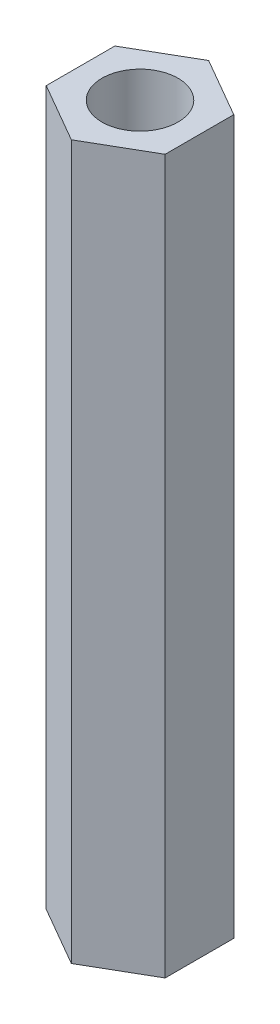
ISO-10303-21;
HEADER;
FILE_DESCRIPTION(('STEP AP214'),'2;1');
FILE_NAME('part.step','',(''),(''),'','','');
FILE_SCHEMA(('AUTOMOTIVE_DESIGN { 1 0 10303 214 1 1 1 1 }'));
ENDSEC;
DATA;
#1=APPLICATION_CONTEXT('core data for automotive mechanical design processes');
#2=APPLICATION_PROTOCOL_DEFINITION('international standard','automotive_design',2000,#1);
#3=PRODUCT_CONTEXT('',#1,'mechanical');
#4=PRODUCT('Part','Part','',(#3));
#5=PRODUCT_RELATED_PRODUCT_CATEGORY('part','',(#4));
#6=PRODUCT_DEFINITION_FORMATION('','',#4);
#7=PRODUCT_DEFINITION_CONTEXT('part definition',#1,'design');
#8=PRODUCT_DEFINITION('design','',#6,#7);
#9=PRODUCT_DEFINITION_SHAPE('','',#8);
#10=(LENGTH_UNIT() NAMED_UNIT(*) SI_UNIT(.MILLI.,.METRE.));
#11=(NAMED_UNIT(*) PLANE_ANGLE_UNIT() SI_UNIT($,.RADIAN.));
#12=(NAMED_UNIT(*) SI_UNIT($,.STERADIAN.) SOLID_ANGLE_UNIT());
#13=UNCERTAINTY_MEASURE_WITH_UNIT(LENGTH_MEASURE(1.E-05),#10,'distance_accuracy_value','');
#14=(GEOMETRIC_REPRESENTATION_CONTEXT(3) GLOBAL_UNCERTAINTY_ASSIGNED_CONTEXT((#13)) GLOBAL_UNIT_ASSIGNED_CONTEXT((#10,
#11,#12)) REPRESENTATION_CONTEXT('',''));
#15=CARTESIAN_POINT('',(0.,0.,0.));
#16=DIRECTION('',(0.,0.,1.));
#17=DIRECTION('',(1.,0.,0.));
#18=AXIS2_PLACEMENT_3D('',#15,#16,#17);
#19=CARTESIAN_POINT('',(0.,30.,0.));
#20=DIRECTION('',(0.,1.,0.));
#21=DIRECTION('',(0.,0.,1.));
#22=AXIS2_PLACEMENT_3D('',#19,#20,#21);
#23=PLANE('',#22);
#24=DIRECTION('',(-0.866025403784438,0.,-0.5));
#25=VECTOR('',#24,1.);
#26=CARTESIAN_POINT('',(2.5,30.,-1.44337567297406));
#27=LINE('',#26,#25);
#28=CARTESIAN_POINT('',(2.5,30.,-1.44337567297406));
#29=VERTEX_POINT('',#28);
#30=CARTESIAN_POINT('',(0.,30.,-2.88675134594813));
#31=VERTEX_POINT('',#30);
#32=EDGE_CURVE('E137',#29,#31,#27,.T.);
#33=ORIENTED_EDGE('',*,*,#32,.T.);
#34=DIRECTION('',(-0.866025403784439,0.,0.5));
#35=VECTOR('',#34,1.);
#36=CARTESIAN_POINT('',(0.,30.,-2.88675134594813));
#37=LINE('',#36,#35);
#38=CARTESIAN_POINT('',(-2.5,30.,-1.44337567297406));
#39=VERTEX_POINT('',#38);
#40=EDGE_CURVE('E95',#31,#39,#37,.T.);
#41=ORIENTED_EDGE('',*,*,#40,.T.);
#42=DIRECTION('',(0.,0.,1.));
#43=VECTOR('',#42,1.);
#44=CARTESIAN_POINT('',(-2.5,30.,-1.44337567297406));
#45=LINE('',#44,#43);
#46=CARTESIAN_POINT('',(-2.5,30.,1.44337567297406));
#47=VERTEX_POINT('',#46);
#48=EDGE_CURVE('E108',#39,#47,#45,.T.);
#49=ORIENTED_EDGE('',*,*,#48,.T.);
#50=DIRECTION('',(0.866025403784439,0.,0.5));
#51=VECTOR('',#50,1.);
#52=CARTESIAN_POINT('',(-2.5,30.,1.44337567297406));
#53=LINE('',#52,#51);
#54=CARTESIAN_POINT('',(0.,30.,2.88675134594813));
#55=VERTEX_POINT('',#54);
#56=EDGE_CURVE('E102',#47,#55,#53,.T.);
#57=ORIENTED_EDGE('',*,*,#56,.T.);
#58=DIRECTION('',(0.866025403784439,0.,-0.5));
#59=VECTOR('',#58,1.);
#60=CARTESIAN_POINT('',(0.,30.,2.88675134594813));
#61=LINE('',#60,#59);
#62=CARTESIAN_POINT('',(2.5,30.,1.44337567297407));
#63=VERTEX_POINT('',#62);
#64=EDGE_CURVE('E106',#55,#63,#61,.T.);
#65=ORIENTED_EDGE('',*,*,#64,.T.);
#66=DIRECTION('',(0.,0.,-1.));
#67=VECTOR('',#66,1.);
#68=CARTESIAN_POINT('',(2.5,30.,1.44337567297407));
#69=LINE('',#68,#67);
#70=EDGE_CURVE('E58',#63,#29,#69,.T.);
#71=ORIENTED_EDGE('',*,*,#70,.T.);
#72=EDGE_LOOP('',(#33,#41,#49,#57,#65,#71));
#73=FACE_BOUND('',#72,.T.);
#74=CARTESIAN_POINT('',(0.,30.,0.));
#75=DIRECTION('',(0.,1.,0.));
#76=DIRECTION('',(0.,0.,1.));
#77=AXIS2_PLACEMENT_3D('',#74,#75,#76);
#78=CIRCLE('',#77,1.6);
#79=CARTESIAN_POINT('',(0.,30.,1.6));
#80=VERTEX_POINT('',#79);
#81=EDGE_CURVE('E130',#80,#80,#78,.T.);
#82=ORIENTED_EDGE('',*,*,#81,.F.);
#83=EDGE_LOOP('',(#82));
#84=FACE_BOUND('',#83,.T.);
#85=ADVANCED_FACE('F41',(#73,#84),#23,.T.);
#86=CARTESIAN_POINT('',(0.,0.,0.));
#87=DIRECTION('',(0.,1.,0.));
#88=DIRECTION('',(0.,0.,1.));
#89=AXIS2_PLACEMENT_3D('',#86,#87,#88);
#90=PLANE('',#89);
#91=DIRECTION('',(-0.866025403784438,0.,-0.5));
#92=VECTOR('',#91,1.);
#93=CARTESIAN_POINT('',(2.5,0.,-1.44337567297406));
#94=LINE('',#93,#92);
#95=CARTESIAN_POINT('',(2.5,0.,-1.44337567297406));
#96=VERTEX_POINT('',#95);
#97=CARTESIAN_POINT('',(0.,0.,-2.88675134594813));
#98=VERTEX_POINT('',#97);
#99=EDGE_CURVE('E126',#96,#98,#94,.T.);
#100=ORIENTED_EDGE('',*,*,#99,.F.);
#101=DIRECTION('',(0.,0.,-1.));
#102=VECTOR('',#101,1.);
#103=CARTESIAN_POINT('',(2.5,0.,1.44337567297407));
#104=LINE('',#103,#102);
#105=CARTESIAN_POINT('',(2.5,0.,1.44337567297407));
#106=VERTEX_POINT('',#105);
#107=EDGE_CURVE('E87',#106,#96,#104,.T.);
#108=ORIENTED_EDGE('',*,*,#107,.F.);
#109=DIRECTION('',(0.866025403784439,0.,-0.5));
#110=VECTOR('',#109,1.);
#111=CARTESIAN_POINT('',(0.,0.,2.88675134594813));
#112=LINE('',#111,#110);
#113=CARTESIAN_POINT('',(0.,0.,2.88675134594813));
#114=VERTEX_POINT('',#113);
#115=EDGE_CURVE('E81',#114,#106,#112,.T.);
#116=ORIENTED_EDGE('',*,*,#115,.F.);
#117=DIRECTION('',(0.866025403784439,0.,0.5));
#118=VECTOR('',#117,1.);
#119=CARTESIAN_POINT('',(-2.5,0.,1.44337567297406));
#120=LINE('',#119,#118);
#121=CARTESIAN_POINT('',(-2.5,0.,1.44337567297406));
#122=VERTEX_POINT('',#121);
#123=EDGE_CURVE('E116',#122,#114,#120,.T.);
#124=ORIENTED_EDGE('',*,*,#123,.F.);
#125=DIRECTION('',(0.,0.,1.));
#126=VECTOR('',#125,1.);
#127=CARTESIAN_POINT('',(-2.5,0.,-1.44337567297406));
#128=LINE('',#127,#126);
#129=CARTESIAN_POINT('',(-2.5,0.,-1.44337567297406));
#130=VERTEX_POINT('',#129);
#131=EDGE_CURVE('E132',#130,#122,#128,.T.);
#132=ORIENTED_EDGE('',*,*,#131,.F.);
#133=DIRECTION('',(-0.866025403784439,0.,0.5));
#134=VECTOR('',#133,1.);
#135=CARTESIAN_POINT('',(0.,0.,-2.88675134594813));
#136=LINE('',#135,#134);
#137=EDGE_CURVE('E129',#98,#130,#136,.T.);
#138=ORIENTED_EDGE('',*,*,#137,.F.);
#139=EDGE_LOOP('',(#100,#108,#116,#124,#132,#138));
#140=FACE_BOUND('',#139,.T.);
#141=CARTESIAN_POINT('',(0.,0.,0.));
#142=DIRECTION('',(0.,1.,0.));
#143=DIRECTION('',(0.,0.,1.));
#144=AXIS2_PLACEMENT_3D('',#141,#142,#143);
#145=CIRCLE('',#144,1.6);
#146=CARTESIAN_POINT('',(0.,0.,1.6));
#147=VERTEX_POINT('',#146);
#148=EDGE_CURVE('E248',#147,#147,#145,.T.);
#149=ORIENTED_EDGE('',*,*,#148,.T.);
#150=EDGE_LOOP('',(#149));
#151=FACE_BOUND('',#150,.T.);
#152=ADVANCED_FACE('F146',(#140,#151),#90,.F.);
#153=CARTESIAN_POINT('',(2.5,30.,-1.44337567297406));
#154=DIRECTION('',(-0.5,0.,0.866025403784438));
#155=DIRECTION('',(0.866025403784439,0.,0.5));
#156=AXIS2_PLACEMENT_3D('',#153,#154,#155);
#157=PLANE('',#156);
#158=ORIENTED_EDGE('',*,*,#99,.T.);
#159=DIRECTION('',(0.,-1.,0.));
#160=VECTOR('',#159,1.);
#161=CARTESIAN_POINT('',(0.,30.,-2.88675134594813));
#162=LINE('',#161,#160);
#163=EDGE_CURVE('E11',#31,#98,#162,.T.);
#164=ORIENTED_EDGE('',*,*,#163,.F.);
#165=ORIENTED_EDGE('',*,*,#32,.F.);
#166=DIRECTION('',(0.,-1.,0.));
#167=VECTOR('',#166,1.);
#168=CARTESIAN_POINT('',(2.5,30.,-1.44337567297406));
#169=LINE('',#168,#167);
#170=EDGE_CURVE('E122',#29,#96,#169,.T.);
#171=ORIENTED_EDGE('',*,*,#170,.T.);
#172=EDGE_LOOP('',(#158,#164,#165,#171));
#173=FACE_BOUND('',#172,.T.);
#174=ADVANCED_FACE('F43',(#173),#157,.F.);
#175=CARTESIAN_POINT('',(0.,30.,-2.88675134594813));
#176=DIRECTION('',(0.5,0.,0.866025403784439));
#177=DIRECTION('',(0.866025403784439,0.,-0.5));
#178=AXIS2_PLACEMENT_3D('',#175,#176,#177);
#179=PLANE('',#178);
#180=ORIENTED_EDGE('',*,*,#137,.T.);
#181=DIRECTION('',(0.,-1.,0.));
#182=VECTOR('',#181,1.);
#183=CARTESIAN_POINT('',(-2.5,30.,-1.44337567297406));
#184=LINE('',#183,#182);
#185=EDGE_CURVE('E50',#39,#130,#184,.T.);
#186=ORIENTED_EDGE('',*,*,#185,.F.);
#187=ORIENTED_EDGE('',*,*,#40,.F.);
#188=ORIENTED_EDGE('',*,*,#163,.T.);
#189=EDGE_LOOP('',(#180,#186,#187,#188));
#190=FACE_BOUND('',#189,.T.);
#191=ADVANCED_FACE('F171',(#190),#179,.F.);
#192=CARTESIAN_POINT('',(-2.5,30.,-1.44337567297406));
#193=DIRECTION('',(1.,0.,0.));
#194=DIRECTION('',(0.,0.,-1.));
#195=AXIS2_PLACEMENT_3D('',#192,#193,#194);
#196=PLANE('',#195);
#197=ORIENTED_EDGE('',*,*,#131,.T.);
#198=DIRECTION('',(0.,-1.,0.));
#199=VECTOR('',#198,1.);
#200=CARTESIAN_POINT('',(-2.5,30.,1.44337567297406));
#201=LINE('',#200,#199);
#202=EDGE_CURVE('E117',#47,#122,#201,.T.);
#203=ORIENTED_EDGE('',*,*,#202,.F.);
#204=ORIENTED_EDGE('',*,*,#48,.F.);
#205=ORIENTED_EDGE('',*,*,#185,.T.);
#206=EDGE_LOOP('',(#197,#203,#204,#205));
#207=FACE_BOUND('',#206,.T.);
#208=ADVANCED_FACE('F143',(#207),#196,.F.);
#209=CARTESIAN_POINT('',(-2.5,30.,1.44337567297406));
#210=DIRECTION('',(0.5,0.,-0.866025403784439));
#211=DIRECTION('',(-0.866025403784439,0.,-0.5));
#212=AXIS2_PLACEMENT_3D('',#209,#210,#211);
#213=PLANE('',#212);
#214=ORIENTED_EDGE('',*,*,#123,.T.);
#215=DIRECTION('',(0.,-1.,0.));
#216=VECTOR('',#215,1.);
#217=CARTESIAN_POINT('',(0.,30.,2.88675134594813));
#218=LINE('',#217,#216);
#219=EDGE_CURVE('E113',#55,#114,#218,.T.);
#220=ORIENTED_EDGE('',*,*,#219,.F.);
#221=ORIENTED_EDGE('',*,*,#56,.F.);
#222=ORIENTED_EDGE('',*,*,#202,.T.);
#223=EDGE_LOOP('',(#214,#220,#221,#222));
#224=FACE_BOUND('',#223,.T.);
#225=ADVANCED_FACE('F114',(#224),#213,.F.);
#226=CARTESIAN_POINT('',(0.,30.,2.88675134594813));
#227=DIRECTION('',(-0.5,0.,-0.866025403784439));
#228=DIRECTION('',(-0.866025403784439,0.,0.5));
#229=AXIS2_PLACEMENT_3D('',#226,#227,#228);
#230=PLANE('',#229);
#231=ORIENTED_EDGE('',*,*,#115,.T.);
#232=DIRECTION('',(0.,-1.,0.));
#233=VECTOR('',#232,1.);
#234=CARTESIAN_POINT('',(2.5,30.,1.44337567297407));
#235=LINE('',#234,#233);
#236=EDGE_CURVE('E118',#63,#106,#235,.T.);
#237=ORIENTED_EDGE('',*,*,#236,.F.);
#238=ORIENTED_EDGE('',*,*,#64,.F.);
#239=ORIENTED_EDGE('',*,*,#219,.T.);
#240=EDGE_LOOP('',(#231,#237,#238,#239));
#241=FACE_BOUND('',#240,.T.);
#242=ADVANCED_FACE('F120',(#241),#230,.F.);
#243=CARTESIAN_POINT('',(2.5,30.,1.44337567297407));
#244=DIRECTION('',(-1.,0.,0.));
#245=DIRECTION('',(0.,0.,1.));
#246=AXIS2_PLACEMENT_3D('',#243,#244,#245);
#247=PLANE('',#246);
#248=ORIENTED_EDGE('',*,*,#107,.T.);
#249=ORIENTED_EDGE('',*,*,#170,.F.);
#250=ORIENTED_EDGE('',*,*,#70,.F.);
#251=ORIENTED_EDGE('',*,*,#236,.T.);
#252=EDGE_LOOP('',(#248,#249,#250,#251));
#253=FACE_BOUND('',#252,.T.);
#254=ADVANCED_FACE('F151',(#253),#247,.F.);
#255=CARTESIAN_POINT('',(0.,30.,0.));
#256=DIRECTION('',(0.,-1.,0.));
#257=DIRECTION('',(0.,0.,-1.));
#258=AXIS2_PLACEMENT_3D('',#255,#256,#257);
#259=CYLINDRICAL_SURFACE('',#258,1.6);
#260=ORIENTED_EDGE('',*,*,#81,.T.);
#261=EDGE_LOOP('',(#260));
#262=FACE_BOUND('',#261,.T.);
#263=ORIENTED_EDGE('',*,*,#148,.F.);
#264=EDGE_LOOP('',(#263));
#265=FACE_BOUND('',#264,.T.);
#266=ADVANCED_FACE('F153',(#262,#265),#259,.F.);
#267=CLOSED_SHELL('',(#85,#152,#174,#191,#208,#225,#242,#254,#266));
#268=MANIFOLD_SOLID_BREP('B2',#267);
#269=ADVANCED_BREP_SHAPE_REPRESENTATION('',(#18,#268),#14);
#270=SHAPE_DEFINITION_REPRESENTATION(#9,#269);
ENDSEC;
END-ISO-10303-21;
